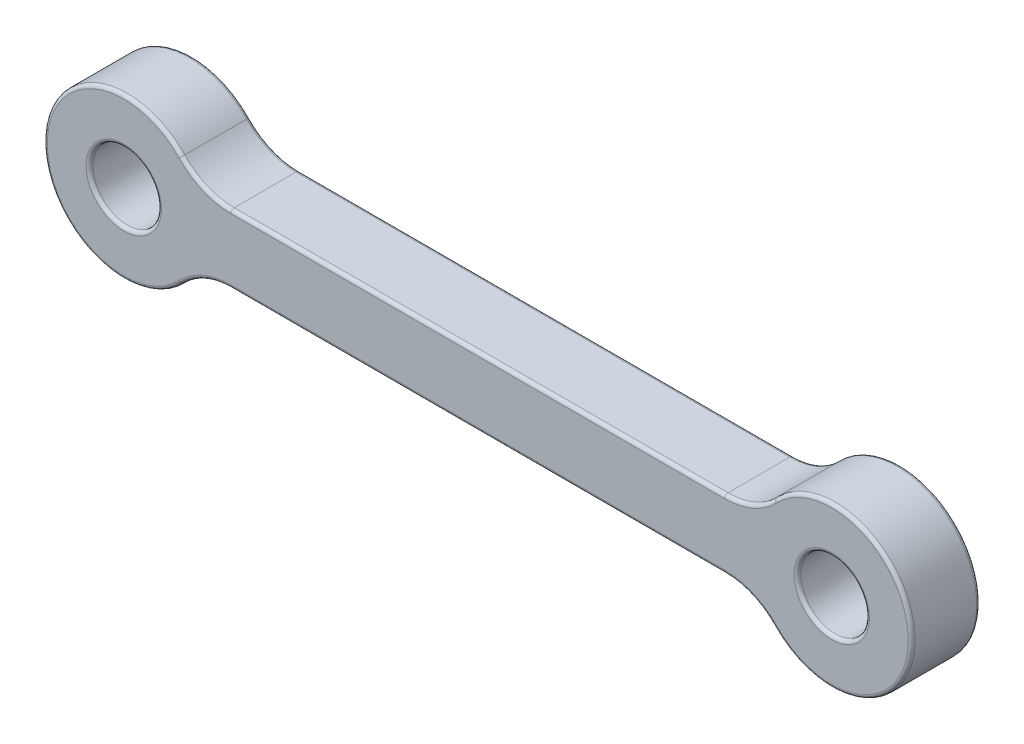
ISO-10303-21;
HEADER;
FILE_DESCRIPTION(('STEP AP214'),'2;1');
FILE_NAME('part.step','',(''),(''),'','','');
FILE_SCHEMA(('AUTOMOTIVE_DESIGN { 1 0 10303 214 1 1 1 1 }'));
ENDSEC;
DATA;
#1=APPLICATION_CONTEXT('core data for automotive mechanical design processes');
#2=APPLICATION_PROTOCOL_DEFINITION('international standard','automotive_design',2000,#1);
#3=PRODUCT_CONTEXT('',#1,'mechanical');
#4=PRODUCT('Part','Part','',(#3));
#5=PRODUCT_RELATED_PRODUCT_CATEGORY('part','',(#4));
#6=PRODUCT_DEFINITION_FORMATION('','',#4);
#7=PRODUCT_DEFINITION_CONTEXT('part definition',#1,'design');
#8=PRODUCT_DEFINITION('design','',#6,#7);
#9=PRODUCT_DEFINITION_SHAPE('','',#8);
#10=(LENGTH_UNIT() NAMED_UNIT(*) SI_UNIT(.MILLI.,.METRE.));
#11=(NAMED_UNIT(*) PLANE_ANGLE_UNIT() SI_UNIT($,.RADIAN.));
#12=(NAMED_UNIT(*) SI_UNIT($,.STERADIAN.) SOLID_ANGLE_UNIT());
#13=UNCERTAINTY_MEASURE_WITH_UNIT(LENGTH_MEASURE(1.E-05),#10,'distance_accuracy_value','');
#14=(GEOMETRIC_REPRESENTATION_CONTEXT(3) GLOBAL_UNCERTAINTY_ASSIGNED_CONTEXT((#13)) GLOBAL_UNIT_ASSIGNED_CONTEXT((#10,
#11,#12)) REPRESENTATION_CONTEXT('',''));
#15=CARTESIAN_POINT('',(0.,0.,0.));
#16=DIRECTION('',(0.,0.,1.));
#17=DIRECTION('',(1.,0.,0.));
#18=AXIS2_PLACEMENT_3D('',#15,#16,#17);
#19=CARTESIAN_POINT('',(0.,0.,1.5));
#20=DIRECTION('',(0.,0.,-1.));
#21=DIRECTION('',(-1.,0.,0.));
#22=AXIS2_PLACEMENT_3D('',#19,#20,#21);
#23=CYLINDRICAL_SURFACE('',#22,3.5);
#24=DIRECTION('',(0.,0.,-1.));
#25=VECTOR('',#24,1.);
#26=CARTESIAN_POINT('',(2.52560848605877,-2.42307692307692,1.5));
#27=LINE('',#26,#25);
#28=CARTESIAN_POINT('',(2.52560848605877,-2.42307692307692,-1.35));
#29=VERTEX_POINT('',#28);
#30=CARTESIAN_POINT('',(2.52560848605877,-2.42307692307692,1.35));
#31=VERTEX_POINT('',#30);
#32=EDGE_CURVE('E310',#29,#31,#27,.F.);
#33=ORIENTED_EDGE('',*,*,#32,.T.);
#34=CARTESIAN_POINT('',(0.,0.,1.35));
#35=DIRECTION('',(0.,0.,1.));
#36=DIRECTION('',(1.,0.,0.));
#37=AXIS2_PLACEMENT_3D('',#34,#35,#36);
#38=CIRCLE('',#37,3.5);
#39=CARTESIAN_POINT('',(2.52560848605877,2.42307692307692,1.35));
#40=VERTEX_POINT('',#39);
#41=EDGE_CURVE('E238',#31,#40,#38,.F.);
#42=ORIENTED_EDGE('',*,*,#41,.T.);
#43=DIRECTION('',(0.,0.,-1.));
#44=VECTOR('',#43,1.);
#45=CARTESIAN_POINT('',(2.52560848605877,2.42307692307692,1.5));
#46=LINE('',#45,#44);
#47=CARTESIAN_POINT('',(2.52560848605877,2.42307692307692,-1.35));
#48=VERTEX_POINT('',#47);
#49=EDGE_CURVE('E365',#40,#48,#46,.T.);
#50=ORIENTED_EDGE('',*,*,#49,.T.);
#51=CARTESIAN_POINT('',(0.,0.,-1.35));
#52=DIRECTION('',(0.,0.,1.));
#53=DIRECTION('',(1.,0.,0.));
#54=AXIS2_PLACEMENT_3D('',#51,#52,#53);
#55=CIRCLE('',#54,3.5);
#56=EDGE_CURVE('E235',#48,#29,#55,.T.);
#57=ORIENTED_EDGE('',*,*,#56,.T.);
#58=EDGE_LOOP('',(#33,#42,#50,#57));
#59=FACE_BOUND('',#58,.T.);
#60=ADVANCED_FACE('F41',(#59),#23,.T.);
#61=CARTESIAN_POINT('',(0.,-1.5,1.5));
#62=DIRECTION('',(0.,-1.,0.));
#63=DIRECTION('',(0.,0.,-1.));
#64=AXIS2_PLACEMENT_3D('',#61,#62,#63);
#65=PLANE('',#64);
#66=DIRECTION('',(0.,0.,1.));
#67=VECTOR('',#66,1.);
#68=CARTESIAN_POINT('',(26.3095842401766,-1.5,1.5));
#69=LINE('',#68,#67);
#70=CARTESIAN_POINT('',(26.3095842401766,-1.5,-1.35));
#71=VERTEX_POINT('',#70);
#72=CARTESIAN_POINT('',(26.3095842401766,-1.5,1.35));
#73=VERTEX_POINT('',#72);
#74=EDGE_CURVE('E380',#71,#73,#69,.T.);
#75=ORIENTED_EDGE('',*,*,#74,.T.);
#76=DIRECTION('',(-1.,0.,0.));
#77=VECTOR('',#76,1.);
#78=CARTESIAN_POINT('',(0.,-1.5,1.35));
#79=LINE('',#78,#77);
#80=CARTESIAN_POINT('',(4.69041575982343,-1.5,1.35));
#81=VERTEX_POINT('',#80);
#82=EDGE_CURVE('E225',#73,#81,#79,.T.);
#83=ORIENTED_EDGE('',*,*,#82,.T.);
#84=DIRECTION('',(0.,0.,-1.));
#85=VECTOR('',#84,1.);
#86=CARTESIAN_POINT('',(4.69041575982343,-1.5,1.5));
#87=LINE('',#86,#85);
#88=CARTESIAN_POINT('',(4.69041575982343,-1.5,-1.35));
#89=VERTEX_POINT('',#88);
#90=EDGE_CURVE('E384',#81,#89,#87,.T.);
#91=ORIENTED_EDGE('',*,*,#90,.T.);
#92=DIRECTION('',(-1.,0.,0.));
#93=VECTOR('',#92,1.);
#94=CARTESIAN_POINT('',(26.3095842401766,-1.5,-1.35));
#95=LINE('',#94,#93);
#96=EDGE_CURVE('E222',#89,#71,#95,.F.);
#97=ORIENTED_EDGE('',*,*,#96,.T.);
#98=EDGE_LOOP('',(#75,#83,#91,#97));
#99=FACE_BOUND('',#98,.T.);
#100=ADVANCED_FACE('F460',(#99),#65,.T.);
#101=CARTESIAN_POINT('',(31.,0.,1.5));
#102=DIRECTION('',(0.,0.,-1.));
#103=DIRECTION('',(-1.,0.,0.));
#104=AXIS2_PLACEMENT_3D('',#101,#102,#103);
#105=CYLINDRICAL_SURFACE('',#104,3.5);
#106=DIRECTION('',(0.,0.,-1.));
#107=VECTOR('',#106,1.);
#108=CARTESIAN_POINT('',(28.4743915139412,2.42307692307692,1.5));
#109=LINE('',#108,#107);
#110=CARTESIAN_POINT('',(28.4743915139412,2.42307692307692,-1.35));
#111=VERTEX_POINT('',#110);
#112=CARTESIAN_POINT('',(28.4743915139412,2.42307692307692,1.35));
#113=VERTEX_POINT('',#112);
#114=EDGE_CURVE('E358',#111,#113,#109,.F.);
#115=ORIENTED_EDGE('',*,*,#114,.T.);
#116=CARTESIAN_POINT('',(31.,0.,1.35));
#117=DIRECTION('',(0.,0.,1.));
#118=DIRECTION('',(1.,0.,0.));
#119=AXIS2_PLACEMENT_3D('',#116,#117,#118);
#120=CIRCLE('',#119,3.5);
#121=CARTESIAN_POINT('',(28.4743915139412,-2.42307692307692,1.35));
#122=VERTEX_POINT('',#121);
#123=EDGE_CURVE('E213',#113,#122,#120,.F.);
#124=ORIENTED_EDGE('',*,*,#123,.T.);
#125=DIRECTION('',(0.,0.,-1.));
#126=VECTOR('',#125,1.);
#127=CARTESIAN_POINT('',(28.4743915139412,-2.42307692307692,1.5));
#128=LINE('',#127,#126);
#129=CARTESIAN_POINT('',(28.4743915139412,-2.42307692307692,-1.35));
#130=VERTEX_POINT('',#129);
#131=EDGE_CURVE('E369',#122,#130,#128,.T.);
#132=ORIENTED_EDGE('',*,*,#131,.T.);
#133=CARTESIAN_POINT('',(31.,0.,-1.35));
#134=DIRECTION('',(0.,0.,1.));
#135=DIRECTION('',(1.,0.,0.));
#136=AXIS2_PLACEMENT_3D('',#133,#134,#135);
#137=CIRCLE('',#136,3.5);
#138=EDGE_CURVE('E210',#130,#111,#137,.T.);
#139=ORIENTED_EDGE('',*,*,#138,.T.);
#140=EDGE_LOOP('',(#115,#124,#132,#139));
#141=FACE_BOUND('',#140,.T.);
#142=ADVANCED_FACE('F414',(#141),#105,.T.);
#143=CARTESIAN_POINT('',(0.,1.5,1.5));
#144=DIRECTION('',(0.,-1.,0.));
#145=DIRECTION('',(0.,0.,-1.));
#146=AXIS2_PLACEMENT_3D('',#143,#144,#145);
#147=PLANE('',#146);
#148=DIRECTION('',(0.,0.,1.));
#149=VECTOR('',#148,1.);
#150=CARTESIAN_POINT('',(4.69041575982343,1.5,1.5));
#151=LINE('',#150,#149);
#152=CARTESIAN_POINT('',(4.69041575982343,1.5,-1.35));
#153=VERTEX_POINT('',#152);
#154=CARTESIAN_POINT('',(4.69041575982343,1.5,1.35));
#155=VERTEX_POINT('',#154);
#156=EDGE_CURVE('E364',#153,#155,#151,.T.);
#157=ORIENTED_EDGE('',*,*,#156,.T.);
#158=DIRECTION('',(-1.,0.,0.));
#159=VECTOR('',#158,1.);
#160=CARTESIAN_POINT('',(26.3095842401766,1.5,1.35));
#161=LINE('',#160,#159);
#162=CARTESIAN_POINT('',(26.3095842401766,1.5,1.35));
#163=VERTEX_POINT('',#162);
#164=EDGE_CURVE('E250',#155,#163,#161,.F.);
#165=ORIENTED_EDGE('',*,*,#164,.T.);
#166=DIRECTION('',(0.,0.,-1.));
#167=VECTOR('',#166,1.);
#168=CARTESIAN_POINT('',(26.3095842401766,1.5,1.5));
#169=LINE('',#168,#167);
#170=CARTESIAN_POINT('',(26.3095842401766,1.5,-1.35));
#171=VERTEX_POINT('',#170);
#172=EDGE_CURVE('E356',#163,#171,#169,.T.);
#173=ORIENTED_EDGE('',*,*,#172,.T.);
#174=DIRECTION('',(-1.,0.,0.));
#175=VECTOR('',#174,1.);
#176=CARTESIAN_POINT('',(0.,1.5,-1.35));
#177=LINE('',#176,#175);
#178=EDGE_CURVE('E247',#171,#153,#177,.T.);
#179=ORIENTED_EDGE('',*,*,#178,.T.);
#180=EDGE_LOOP('',(#157,#165,#173,#179));
#181=FACE_BOUND('',#180,.T.);
#182=ADVANCED_FACE('F361',(#181),#147,.F.);
#183=CARTESIAN_POINT('',(0.,0.,1.5));
#184=DIRECTION('',(0.,0.,-1.));
#185=DIRECTION('',(-1.,0.,0.));
#186=AXIS2_PLACEMENT_3D('',#183,#184,#185);
#187=CYLINDRICAL_SURFACE('',#186,1.5);
#188=CARTESIAN_POINT('',(0.,0.,1.35));
#189=DIRECTION('',(0.,0.,1.));
#190=DIRECTION('',(1.,0.,0.));
#191=AXIS2_PLACEMENT_3D('',#188,#189,#190);
#192=CIRCLE('',#191,1.5);
#193=CARTESIAN_POINT('',(1.5,0.,1.35));
#194=VERTEX_POINT('',#193);
#195=EDGE_CURVE('E257',#194,#194,#192,.T.);
#196=ORIENTED_EDGE('',*,*,#195,.T.);
#197=EDGE_LOOP('',(#196));
#198=FACE_BOUND('',#197,.T.);
#199=CARTESIAN_POINT('',(0.,0.,-1.35));
#200=DIRECTION('',(0.,0.,1.));
#201=DIRECTION('',(1.,0.,0.));
#202=AXIS2_PLACEMENT_3D('',#199,#200,#201);
#203=CIRCLE('',#202,1.5);
#204=CARTESIAN_POINT('',(1.5,0.,-1.35));
#205=VERTEX_POINT('',#204);
#206=EDGE_CURVE('E253',#205,#205,#203,.F.);
#207=ORIENTED_EDGE('',*,*,#206,.T.);
#208=EDGE_LOOP('',(#207));
#209=FACE_BOUND('',#208,.T.);
#210=ADVANCED_FACE('F471',(#198,#209),#187,.F.);
#211=CARTESIAN_POINT('',(31.,0.,1.5));
#212=DIRECTION('',(0.,0.,-1.));
#213=DIRECTION('',(-1.,0.,0.));
#214=AXIS2_PLACEMENT_3D('',#211,#212,#213);
#215=CYLINDRICAL_SURFACE('',#214,1.5);
#216=CARTESIAN_POINT('',(31.,0.,1.35));
#217=DIRECTION('',(0.,0.,1.));
#218=DIRECTION('',(1.,0.,0.));
#219=AXIS2_PLACEMENT_3D('',#216,#217,#218);
#220=CIRCLE('',#219,1.5);
#221=CARTESIAN_POINT('',(32.5,0.,1.35));
#222=VERTEX_POINT('',#221);
#223=EDGE_CURVE('E201',#222,#222,#220,.T.);
#224=ORIENTED_EDGE('',*,*,#223,.T.);
#225=EDGE_LOOP('',(#224));
#226=FACE_BOUND('',#225,.T.);
#227=CARTESIAN_POINT('',(31.,0.,-1.35));
#228=DIRECTION('',(0.,0.,1.));
#229=DIRECTION('',(1.,0.,0.));
#230=AXIS2_PLACEMENT_3D('',#227,#228,#229);
#231=CIRCLE('',#230,1.5);
#232=CARTESIAN_POINT('',(32.5,0.,-1.35));
#233=VERTEX_POINT('',#232);
#234=EDGE_CURVE('E192',#233,#233,#231,.F.);
#235=ORIENTED_EDGE('',*,*,#234,.T.);
#236=EDGE_LOOP('',(#235));
#237=FACE_BOUND('',#236,.T.);
#238=ADVANCED_FACE('F474',(#226,#237),#215,.F.);
#239=CARTESIAN_POINT('',(0.,0.,1.5));
#240=DIRECTION('',(0.,0.,1.));
#241=DIRECTION('',(1.,0.,0.));
#242=AXIS2_PLACEMENT_3D('',#239,#240,#241);
#243=PLANE('',#242);
#244=CARTESIAN_POINT('',(31.,0.,1.5));
#245=DIRECTION('',(0.,0.,1.));
#246=DIRECTION('',(1.,0.,0.));
#247=AXIS2_PLACEMENT_3D('',#244,#245,#246);
#248=CIRCLE('',#247,1.65);
#249=CARTESIAN_POINT('',(32.65,0.,1.5));
#250=VERTEX_POINT('',#249);
#251=EDGE_CURVE('E187',#250,#250,#248,.F.);
#252=ORIENTED_EDGE('',*,*,#251,.T.);
#253=EDGE_LOOP('',(#252));
#254=FACE_BOUND('',#253,.T.);
#255=CARTESIAN_POINT('',(31.,0.,1.5));
#256=DIRECTION('',(0.,0.,1.));
#257=DIRECTION('',(1.,0.,0.));
#258=AXIS2_PLACEMENT_3D('',#255,#256,#257);
#259=CIRCLE('',#258,3.35);
#260=CARTESIAN_POINT('',(28.5826318776295,-2.31923076923077,1.5));
#261=VERTEX_POINT('',#260);
#262=CARTESIAN_POINT('',(28.5826318776295,2.31923076923077,1.5));
#263=VERTEX_POINT('',#262);
#264=EDGE_CURVE('E184',#261,#263,#259,.T.);
#265=ORIENTED_EDGE('',*,*,#264,.T.);
#266=CARTESIAN_POINT('',(26.3095842401766,4.5,1.5));
#267=DIRECTION('',(0.,0.,1.));
#268=DIRECTION('',(1.,0.,0.));
#269=AXIS2_PLACEMENT_3D('',#266,#267,#268);
#270=CIRCLE('',#269,3.15);
#271=CARTESIAN_POINT('',(26.3095842401766,1.35,1.5));
#272=VERTEX_POINT('',#271);
#273=EDGE_CURVE('E162',#263,#272,#270,.F.);
#274=ORIENTED_EDGE('',*,*,#273,.T.);
#275=DIRECTION('',(-1.,0.,0.));
#276=VECTOR('',#275,1.);
#277=CARTESIAN_POINT('',(4.69041575982343,1.35,1.5));
#278=LINE('',#277,#276);
#279=CARTESIAN_POINT('',(4.69041575982343,1.35,1.5));
#280=VERTEX_POINT('',#279);
#281=EDGE_CURVE('E171',#272,#280,#278,.T.);
#282=ORIENTED_EDGE('',*,*,#281,.T.);
#283=CARTESIAN_POINT('',(4.69041575982343,4.5,1.5));
#284=DIRECTION('',(0.,0.,1.));
#285=DIRECTION('',(1.,0.,0.));
#286=AXIS2_PLACEMENT_3D('',#283,#284,#285);
#287=CIRCLE('',#286,3.15);
#288=CARTESIAN_POINT('',(2.41736812237054,2.31923076923077,1.5));
#289=VERTEX_POINT('',#288);
#290=EDGE_CURVE('E178',#280,#289,#287,.F.);
#291=ORIENTED_EDGE('',*,*,#290,.T.);
#292=CARTESIAN_POINT('',(0.,0.,1.5));
#293=DIRECTION('',(0.,0.,1.));
#294=DIRECTION('',(1.,0.,0.));
#295=AXIS2_PLACEMENT_3D('',#292,#293,#294);
#296=CIRCLE('',#295,3.35);
#297=CARTESIAN_POINT('',(2.41736812237054,-2.31923076923077,1.5));
#298=VERTEX_POINT('',#297);
#299=EDGE_CURVE('E393',#289,#298,#296,.T.);
#300=ORIENTED_EDGE('',*,*,#299,.T.);
#301=CARTESIAN_POINT('',(4.69041575982343,-4.5,1.5));
#302=DIRECTION('',(0.,0.,1.));
#303=DIRECTION('',(1.,0.,0.));
#304=AXIS2_PLACEMENT_3D('',#301,#302,#303);
#305=CIRCLE('',#304,3.15);
#306=CARTESIAN_POINT('',(4.69041575982343,-1.35,1.5));
#307=VERTEX_POINT('',#306);
#308=EDGE_CURVE('E396',#298,#307,#305,.F.);
#309=ORIENTED_EDGE('',*,*,#308,.T.);
#310=DIRECTION('',(-1.,0.,0.));
#311=VECTOR('',#310,1.);
#312=CARTESIAN_POINT('',(0.,-1.35,1.5));
#313=LINE('',#312,#311);
#314=CARTESIAN_POINT('',(26.3095842401766,-1.35,1.5));
#315=VERTEX_POINT('',#314);
#316=EDGE_CURVE('E399',#307,#315,#313,.F.);
#317=ORIENTED_EDGE('',*,*,#316,.T.);
#318=CARTESIAN_POINT('',(26.3095842401766,-4.5,1.5));
#319=DIRECTION('',(0.,0.,1.));
#320=DIRECTION('',(1.,0.,0.));
#321=AXIS2_PLACEMENT_3D('',#318,#319,#320);
#322=CIRCLE('',#321,3.15);
#323=EDGE_CURVE('E194',#315,#261,#322,.F.);
#324=ORIENTED_EDGE('',*,*,#323,.T.);
#325=EDGE_LOOP('',(#265,#274,#282,#291,#300,#309,#317,#324));
#326=FACE_BOUND('',#325,.T.);
#327=CARTESIAN_POINT('',(0.,0.,1.5));
#328=DIRECTION('',(0.,0.,1.));
#329=DIRECTION('',(1.,0.,0.));
#330=AXIS2_PLACEMENT_3D('',#327,#328,#329);
#331=CIRCLE('',#330,1.65);
#332=CARTESIAN_POINT('',(1.65,0.,1.5));
#333=VERTEX_POINT('',#332);
#334=EDGE_CURVE('E179',#333,#333,#331,.F.);
#335=ORIENTED_EDGE('',*,*,#334,.T.);
#336=EDGE_LOOP('',(#335));
#337=FACE_BOUND('',#336,.T.);
#338=ADVANCED_FACE('F181',(#254,#326,#337),#243,.T.);
#339=CARTESIAN_POINT('',(0.,0.,-1.5));
#340=DIRECTION('',(0.,0.,1.));
#341=DIRECTION('',(1.,0.,0.));
#342=AXIS2_PLACEMENT_3D('',#339,#340,#341);
#343=PLANE('',#342);
#344=CARTESIAN_POINT('',(31.,0.,-1.5));
#345=DIRECTION('',(0.,0.,1.));
#346=DIRECTION('',(1.,0.,0.));
#347=AXIS2_PLACEMENT_3D('',#344,#345,#346);
#348=CIRCLE('',#347,1.65);
#349=CARTESIAN_POINT('',(32.65,0.,-1.5));
#350=VERTEX_POINT('',#349);
#351=EDGE_CURVE('E11',#350,#350,#348,.T.);
#352=ORIENTED_EDGE('',*,*,#351,.T.);
#353=EDGE_LOOP('',(#352));
#354=FACE_BOUND('',#353,.T.);
#355=DIRECTION('',(-1.,0.,0.));
#356=VECTOR('',#355,1.);
#357=CARTESIAN_POINT('',(4.69041575982343,-1.35,-1.5));
#358=LINE('',#357,#356);
#359=CARTESIAN_POINT('',(26.3095842401766,-1.35,-1.5));
#360=VERTEX_POINT('',#359);
#361=CARTESIAN_POINT('',(4.69041575982343,-1.35,-1.5));
#362=VERTEX_POINT('',#361);
#363=EDGE_CURVE('E59',#360,#362,#358,.T.);
#364=ORIENTED_EDGE('',*,*,#363,.T.);
#365=CARTESIAN_POINT('',(4.69041575982343,-4.5,-1.5));
#366=DIRECTION('',(0.,0.,1.));
#367=DIRECTION('',(1.,0.,0.));
#368=AXIS2_PLACEMENT_3D('',#365,#366,#367);
#369=CIRCLE('',#368,3.15);
#370=CARTESIAN_POINT('',(2.41736812237054,-2.31923076923077,-1.5));
#371=VERTEX_POINT('',#370);
#372=EDGE_CURVE('E51',#362,#371,#369,.T.);
#373=ORIENTED_EDGE('',*,*,#372,.T.);
#374=CARTESIAN_POINT('',(0.,0.,-1.5));
#375=DIRECTION('',(0.,0.,1.));
#376=DIRECTION('',(1.,0.,0.));
#377=AXIS2_PLACEMENT_3D('',#374,#375,#376);
#378=CIRCLE('',#377,3.35);
#379=CARTESIAN_POINT('',(2.41736812237054,2.31923076923077,-1.5));
#380=VERTEX_POINT('',#379);
#381=EDGE_CURVE('E265',#371,#380,#378,.F.);
#382=ORIENTED_EDGE('',*,*,#381,.T.);
#383=CARTESIAN_POINT('',(4.69041575982343,4.5,-1.5));
#384=DIRECTION('',(0.,0.,1.));
#385=DIRECTION('',(1.,0.,0.));
#386=AXIS2_PLACEMENT_3D('',#383,#384,#385);
#387=CIRCLE('',#386,3.15);
#388=CARTESIAN_POINT('',(4.69041575982343,1.35,-1.5));
#389=VERTEX_POINT('',#388);
#390=EDGE_CURVE('E268',#380,#389,#387,.T.);
#391=ORIENTED_EDGE('',*,*,#390,.T.);
#392=DIRECTION('',(-1.,0.,0.));
#393=VECTOR('',#392,1.);
#394=CARTESIAN_POINT('',(0.,1.35,-1.5));
#395=LINE('',#394,#393);
#396=CARTESIAN_POINT('',(26.3095842401766,1.35,-1.5));
#397=VERTEX_POINT('',#396);
#398=EDGE_CURVE('E271',#389,#397,#395,.F.);
#399=ORIENTED_EDGE('',*,*,#398,.T.);
#400=CARTESIAN_POINT('',(26.3095842401766,4.5,-1.5));
#401=DIRECTION('',(0.,0.,1.));
#402=DIRECTION('',(1.,0.,0.));
#403=AXIS2_PLACEMENT_3D('',#400,#401,#402);
#404=CIRCLE('',#403,3.15);
#405=CARTESIAN_POINT('',(28.5826318776295,2.31923076923077,-1.5));
#406=VERTEX_POINT('',#405);
#407=EDGE_CURVE('E274',#397,#406,#404,.T.);
#408=ORIENTED_EDGE('',*,*,#407,.T.);
#409=CARTESIAN_POINT('',(31.,0.,-1.5));
#410=DIRECTION('',(0.,0.,1.));
#411=DIRECTION('',(1.,0.,0.));
#412=AXIS2_PLACEMENT_3D('',#409,#410,#411);
#413=CIRCLE('',#412,3.35);
#414=CARTESIAN_POINT('',(28.5826318776295,-2.31923076923077,-1.5));
#415=VERTEX_POINT('',#414);
#416=EDGE_CURVE('E277',#406,#415,#413,.F.);
#417=ORIENTED_EDGE('',*,*,#416,.T.);
#418=CARTESIAN_POINT('',(26.3095842401766,-4.5,-1.5));
#419=DIRECTION('',(0.,0.,1.));
#420=DIRECTION('',(1.,0.,0.));
#421=AXIS2_PLACEMENT_3D('',#418,#419,#420);
#422=CIRCLE('',#421,3.15);
#423=EDGE_CURVE('E64',#415,#360,#422,.T.);
#424=ORIENTED_EDGE('',*,*,#423,.T.);
#425=EDGE_LOOP('',(#364,#373,#382,#391,#399,#408,#417,#424));
#426=FACE_BOUND('',#425,.T.);
#427=CARTESIAN_POINT('',(0.,0.,-1.5));
#428=DIRECTION('',(0.,0.,1.));
#429=DIRECTION('',(1.,0.,0.));
#430=AXIS2_PLACEMENT_3D('',#427,#428,#429);
#431=CIRCLE('',#430,1.65);
#432=CARTESIAN_POINT('',(1.65,0.,-1.5));
#433=VERTEX_POINT('',#432);
#434=EDGE_CURVE('E261',#433,#433,#431,.T.);
#435=ORIENTED_EDGE('',*,*,#434,.T.);
#436=EDGE_LOOP('',(#435));
#437=FACE_BOUND('',#436,.T.);
#438=ADVANCED_FACE('F430',(#354,#426,#437),#343,.F.);
#439=CARTESIAN_POINT('',(4.69041575982343,4.5,1.5));
#440=DIRECTION('',(0.,0.,-1.));
#441=DIRECTION('',(-1.,0.,0.));
#442=AXIS2_PLACEMENT_3D('',#439,#440,#441);
#443=CYLINDRICAL_SURFACE('',#442,3.);
#444=ORIENTED_EDGE('',*,*,#49,.F.);
#445=CARTESIAN_POINT('',(4.69041575982343,4.5,1.35));
#446=DIRECTION('',(0.,0.,1.));
#447=DIRECTION('',(1.,0.,0.));
#448=AXIS2_PLACEMENT_3D('',#445,#446,#447);
#449=CIRCLE('',#448,3.);
#450=EDGE_CURVE('E244',#40,#155,#449,.T.);
#451=ORIENTED_EDGE('',*,*,#450,.T.);
#452=ORIENTED_EDGE('',*,*,#156,.F.);
#453=CARTESIAN_POINT('',(4.69041575982343,4.5,-1.35));
#454=DIRECTION('',(0.,0.,1.));
#455=DIRECTION('',(1.,0.,0.));
#456=AXIS2_PLACEMENT_3D('',#453,#454,#455);
#457=CIRCLE('',#456,3.);
#458=EDGE_CURVE('E241',#153,#48,#457,.F.);
#459=ORIENTED_EDGE('',*,*,#458,.T.);
#460=EDGE_LOOP('',(#444,#451,#452,#459));
#461=FACE_BOUND('',#460,.T.);
#462=ADVANCED_FACE('F476',(#461),#443,.F.);
#463=CARTESIAN_POINT('',(26.3095842401766,4.5,1.5));
#464=DIRECTION('',(0.,0.,-1.));
#465=DIRECTION('',(-1.,0.,0.));
#466=AXIS2_PLACEMENT_3D('',#463,#464,#465);
#467=CYLINDRICAL_SURFACE('',#466,3.);
#468=ORIENTED_EDGE('',*,*,#172,.F.);
#469=CARTESIAN_POINT('',(26.3095842401766,4.5,1.35));
#470=DIRECTION('',(0.,0.,1.));
#471=DIRECTION('',(1.,0.,0.));
#472=AXIS2_PLACEMENT_3D('',#469,#470,#471);
#473=CIRCLE('',#472,3.);
#474=EDGE_CURVE('E164',#163,#113,#473,.T.);
#475=ORIENTED_EDGE('',*,*,#474,.T.);
#476=ORIENTED_EDGE('',*,*,#114,.F.);
#477=CARTESIAN_POINT('',(26.3095842401766,4.5,-1.35));
#478=DIRECTION('',(0.,0.,1.));
#479=DIRECTION('',(1.,0.,0.));
#480=AXIS2_PLACEMENT_3D('',#477,#478,#479);
#481=CIRCLE('',#480,3.);
#482=EDGE_CURVE('E205',#111,#171,#481,.F.);
#483=ORIENTED_EDGE('',*,*,#482,.T.);
#484=EDGE_LOOP('',(#468,#475,#476,#483));
#485=FACE_BOUND('',#484,.T.);
#486=ADVANCED_FACE('F355',(#485),#467,.F.);
#487=CARTESIAN_POINT('',(4.69041575982343,-4.5,1.5));
#488=DIRECTION('',(0.,0.,-1.));
#489=DIRECTION('',(-1.,0.,0.));
#490=AXIS2_PLACEMENT_3D('',#487,#488,#489);
#491=CYLINDRICAL_SURFACE('',#490,3.);
#492=ORIENTED_EDGE('',*,*,#90,.F.);
#493=CARTESIAN_POINT('',(4.69041575982343,-4.5,1.35));
#494=DIRECTION('',(0.,0.,1.));
#495=DIRECTION('',(1.,0.,0.));
#496=AXIS2_PLACEMENT_3D('',#493,#494,#495);
#497=CIRCLE('',#496,3.);
#498=EDGE_CURVE('E232',#81,#31,#497,.T.);
#499=ORIENTED_EDGE('',*,*,#498,.T.);
#500=ORIENTED_EDGE('',*,*,#32,.F.);
#501=CARTESIAN_POINT('',(4.69041575982343,-4.5,-1.35));
#502=DIRECTION('',(0.,0.,1.));
#503=DIRECTION('',(1.,0.,0.));
#504=AXIS2_PLACEMENT_3D('',#501,#502,#503);
#505=CIRCLE('',#504,3.);
#506=EDGE_CURVE('E228',#29,#89,#505,.F.);
#507=ORIENTED_EDGE('',*,*,#506,.T.);
#508=EDGE_LOOP('',(#492,#499,#500,#507));
#509=FACE_BOUND('',#508,.T.);
#510=ADVANCED_FACE('F448',(#509),#491,.F.);
#511=CARTESIAN_POINT('',(26.3095842401766,-4.5,1.5));
#512=DIRECTION('',(0.,0.,-1.));
#513=DIRECTION('',(-1.,0.,0.));
#514=AXIS2_PLACEMENT_3D('',#511,#512,#513);
#515=CYLINDRICAL_SURFACE('',#514,3.);
#516=ORIENTED_EDGE('',*,*,#131,.F.);
#517=CARTESIAN_POINT('',(26.3095842401766,-4.5,1.35));
#518=DIRECTION('',(0.,0.,1.));
#519=DIRECTION('',(1.,0.,0.));
#520=AXIS2_PLACEMENT_3D('',#517,#518,#519);
#521=CIRCLE('',#520,3.);
#522=EDGE_CURVE('E219',#122,#73,#521,.T.);
#523=ORIENTED_EDGE('',*,*,#522,.T.);
#524=ORIENTED_EDGE('',*,*,#74,.F.);
#525=CARTESIAN_POINT('',(26.3095842401766,-4.5,-1.35));
#526=DIRECTION('',(0.,0.,1.));
#527=DIRECTION('',(1.,0.,0.));
#528=AXIS2_PLACEMENT_3D('',#525,#526,#527);
#529=CIRCLE('',#528,3.);
#530=EDGE_CURVE('E216',#71,#130,#529,.F.);
#531=ORIENTED_EDGE('',*,*,#530,.T.);
#532=EDGE_LOOP('',(#516,#523,#524,#531));
#533=FACE_BOUND('',#532,.T.);
#534=ADVANCED_FACE('F416',(#533),#515,.F.);
#535=CARTESIAN_POINT('',(31.,0.,1.35));
#536=DIRECTION('',(0.,0.,1.));
#537=DIRECTION('',(1.,0.,0.));
#538=AXIS2_PLACEMENT_3D('',#535,#536,#537);
#539=TOROIDAL_SURFACE('',#538,1.65,0.15);
#540=ORIENTED_EDGE('',*,*,#223,.F.);
#541=EDGE_LOOP('',(#540));
#542=FACE_BOUND('',#541,.T.);
#543=ORIENTED_EDGE('',*,*,#251,.F.);
#544=EDGE_LOOP('',(#543));
#545=FACE_BOUND('',#544,.T.);
#546=ADVANCED_FACE('F486',(#542,#545),#539,.T.);
#547=CARTESIAN_POINT('',(4.69041575982343,-4.5,1.35));
#548=DIRECTION('',(0.,0.,1.));
#549=DIRECTION('',(1.,0.,0.));
#550=AXIS2_PLACEMENT_3D('',#547,#548,#549);
#551=TOROIDAL_SURFACE('',#550,3.15,0.15);
#552=CARTESIAN_POINT('',(2.41736812237054,-2.31923076923077,1.35));
#553=DIRECTION('',(-0.692307692307693,-0.72160242458822,0.));
#554=DIRECTION('',(0.72160242458822,-0.692307692307693,0.));
#555=AXIS2_PLACEMENT_3D('',#552,#553,#554);
#556=CIRCLE('',#555,0.15);
#557=EDGE_CURVE('E302',#31,#298,#556,.T.);
#558=ORIENTED_EDGE('',*,*,#557,.F.);
#559=ORIENTED_EDGE('',*,*,#498,.F.);
#560=CARTESIAN_POINT('',(4.69041575982343,-1.35,1.35));
#561=DIRECTION('',(1.,0.,0.));
#562=DIRECTION('',(0.,0.,-1.));
#563=AXIS2_PLACEMENT_3D('',#560,#561,#562);
#564=CIRCLE('',#563,0.15);
#565=EDGE_CURVE('E306',#307,#81,#564,.T.);
#566=ORIENTED_EDGE('',*,*,#565,.F.);
#567=ORIENTED_EDGE('',*,*,#308,.F.);
#568=EDGE_LOOP('',(#558,#559,#566,#567));
#569=FACE_BOUND('',#568,.T.);
#570=ADVANCED_FACE('F453',(#569),#551,.T.);
#571=CARTESIAN_POINT('',(0.,-1.35,1.35));
#572=DIRECTION('',(-1.,0.,0.));
#573=DIRECTION('',(0.,0.,1.));
#574=AXIS2_PLACEMENT_3D('',#571,#572,#573);
#575=CYLINDRICAL_SURFACE('',#574,0.15);
#576=ORIENTED_EDGE('',*,*,#565,.T.);
#577=ORIENTED_EDGE('',*,*,#82,.F.);
#578=CARTESIAN_POINT('',(26.3095842401766,-1.35,1.35));
#579=DIRECTION('',(1.,0.,0.));
#580=DIRECTION('',(0.,0.,-1.));
#581=AXIS2_PLACEMENT_3D('',#578,#579,#580);
#582=CIRCLE('',#581,0.15);
#583=EDGE_CURVE('E298',#315,#73,#582,.T.);
#584=ORIENTED_EDGE('',*,*,#583,.F.);
#585=ORIENTED_EDGE('',*,*,#316,.F.);
#586=EDGE_LOOP('',(#576,#577,#584,#585));
#587=FACE_BOUND('',#586,.T.);
#588=ADVANCED_FACE('F458',(#587),#575,.T.);
#589=CARTESIAN_POINT('',(0.,0.,1.35));
#590=DIRECTION('',(0.,0.,1.));
#591=DIRECTION('',(1.,0.,0.));
#592=AXIS2_PLACEMENT_3D('',#589,#590,#591);
#593=TOROIDAL_SURFACE('',#592,3.35,0.15);
#594=ORIENTED_EDGE('',*,*,#557,.T.);
#595=ORIENTED_EDGE('',*,*,#299,.F.);
#596=CARTESIAN_POINT('',(2.41736812237054,2.31923076923077,1.35));
#597=DIRECTION('',(0.692307692307693,-0.72160242458822,0.));
#598=DIRECTION('',(0.72160242458822,0.692307692307693,0.));
#599=AXIS2_PLACEMENT_3D('',#596,#597,#598);
#600=CIRCLE('',#599,0.15);
#601=EDGE_CURVE('E294',#40,#289,#600,.T.);
#602=ORIENTED_EDGE('',*,*,#601,.F.);
#603=ORIENTED_EDGE('',*,*,#41,.F.);
#604=EDGE_LOOP('',(#594,#595,#602,#603));
#605=FACE_BOUND('',#604,.T.);
#606=ADVANCED_FACE('F503',(#605),#593,.T.);
#607=CARTESIAN_POINT('',(26.3095842401766,-4.5,1.35));
#608=DIRECTION('',(0.,0.,1.));
#609=DIRECTION('',(1.,0.,0.));
#610=AXIS2_PLACEMENT_3D('',#607,#608,#609);
#611=TOROIDAL_SURFACE('',#610,3.15,0.15);
#612=ORIENTED_EDGE('',*,*,#583,.T.);
#613=ORIENTED_EDGE('',*,*,#522,.F.);
#614=CARTESIAN_POINT('',(28.5826318776295,-2.31923076923077,1.35));
#615=DIRECTION('',(0.692307692307703,-0.72160242458821,0.));
#616=DIRECTION('',(0.72160242458821,0.692307692307703,0.));
#617=AXIS2_PLACEMENT_3D('',#614,#615,#616);
#618=CIRCLE('',#617,0.15);
#619=EDGE_CURVE('E290',#261,#122,#618,.T.);
#620=ORIENTED_EDGE('',*,*,#619,.F.);
#621=ORIENTED_EDGE('',*,*,#323,.F.);
#622=EDGE_LOOP('',(#612,#613,#620,#621));
#623=FACE_BOUND('',#622,.T.);
#624=ADVANCED_FACE('F408',(#623),#611,.T.);
#625=CARTESIAN_POINT('',(4.69041575982343,4.5,1.35));
#626=DIRECTION('',(0.,0.,1.));
#627=DIRECTION('',(1.,0.,0.));
#628=AXIS2_PLACEMENT_3D('',#625,#626,#627);
#629=TOROIDAL_SURFACE('',#628,3.15,0.15);
#630=ORIENTED_EDGE('',*,*,#601,.T.);
#631=ORIENTED_EDGE('',*,*,#290,.F.);
#632=CARTESIAN_POINT('',(4.69041575982343,1.35,1.35));
#633=DIRECTION('',(1.,0.,0.));
#634=DIRECTION('',(0.,0.,-1.));
#635=AXIS2_PLACEMENT_3D('',#632,#633,#634);
#636=CIRCLE('',#635,0.15);
#637=EDGE_CURVE('E174',#155,#280,#636,.T.);
#638=ORIENTED_EDGE('',*,*,#637,.F.);
#639=ORIENTED_EDGE('',*,*,#450,.F.);
#640=EDGE_LOOP('',(#630,#631,#638,#639));
#641=FACE_BOUND('',#640,.T.);
#642=ADVANCED_FACE('F497',(#641),#629,.T.);
#643=CARTESIAN_POINT('',(31.,0.,1.35));
#644=DIRECTION('',(0.,0.,1.));
#645=DIRECTION('',(1.,0.,0.));
#646=AXIS2_PLACEMENT_3D('',#643,#644,#645);
#647=TOROIDAL_SURFACE('',#646,3.35,0.15);
#648=ORIENTED_EDGE('',*,*,#619,.T.);
#649=ORIENTED_EDGE('',*,*,#123,.F.);
#650=CARTESIAN_POINT('',(28.5826318776295,2.31923076923077,1.35));
#651=DIRECTION('',(-0.692307692307698,-0.721602424588214,0.));
#652=DIRECTION('',(0.721602424588214,-0.692307692307698,0.));
#653=AXIS2_PLACEMENT_3D('',#650,#651,#652);
#654=CIRCLE('',#653,0.15);
#655=EDGE_CURVE('E168',#263,#113,#654,.T.);
#656=ORIENTED_EDGE('',*,*,#655,.F.);
#657=ORIENTED_EDGE('',*,*,#264,.F.);
#658=EDGE_LOOP('',(#648,#649,#656,#657));
#659=FACE_BOUND('',#658,.T.);
#660=ADVANCED_FACE('F411',(#659),#647,.T.);
#661=CARTESIAN_POINT('',(0.,1.35,1.35));
#662=DIRECTION('',(1.,0.,0.));
#663=DIRECTION('',(0.,0.,-1.));
#664=AXIS2_PLACEMENT_3D('',#661,#662,#663);
#665=CYLINDRICAL_SURFACE('',#664,0.15);
#666=ORIENTED_EDGE('',*,*,#637,.T.);
#667=ORIENTED_EDGE('',*,*,#281,.F.);
#668=CARTESIAN_POINT('',(26.3095842401766,1.35,1.35));
#669=DIRECTION('',(1.,0.,0.));
#670=DIRECTION('',(0.,0.,-1.));
#671=AXIS2_PLACEMENT_3D('',#668,#669,#670);
#672=CIRCLE('',#671,0.15);
#673=EDGE_CURVE('E158',#163,#272,#672,.T.);
#674=ORIENTED_EDGE('',*,*,#673,.F.);
#675=ORIENTED_EDGE('',*,*,#164,.F.);
#676=EDGE_LOOP('',(#666,#667,#674,#675));
#677=FACE_BOUND('',#676,.T.);
#678=ADVANCED_FACE('F172',(#677),#665,.T.);
#679=CARTESIAN_POINT('',(26.3095842401766,4.5,1.35));
#680=DIRECTION('',(0.,0.,1.));
#681=DIRECTION('',(1.,0.,0.));
#682=AXIS2_PLACEMENT_3D('',#679,#680,#681);
#683=TOROIDAL_SURFACE('',#682,3.15,0.15);
#684=ORIENTED_EDGE('',*,*,#655,.T.);
#685=ORIENTED_EDGE('',*,*,#474,.F.);
#686=ORIENTED_EDGE('',*,*,#673,.T.);
#687=ORIENTED_EDGE('',*,*,#273,.F.);
#688=EDGE_LOOP('',(#684,#685,#686,#687));
#689=FACE_BOUND('',#688,.T.);
#690=ADVANCED_FACE('F160',(#689),#683,.T.);
#691=CARTESIAN_POINT('',(0.,0.,1.35));
#692=DIRECTION('',(0.,0.,1.));
#693=DIRECTION('',(1.,0.,0.));
#694=AXIS2_PLACEMENT_3D('',#691,#692,#693);
#695=TOROIDAL_SURFACE('',#694,1.65,0.15);
#696=ORIENTED_EDGE('',*,*,#334,.F.);
#697=EDGE_LOOP('',(#696));
#698=FACE_BOUND('',#697,.T.);
#699=ORIENTED_EDGE('',*,*,#195,.F.);
#700=EDGE_LOOP('',(#699));
#701=FACE_BOUND('',#700,.T.);
#702=ADVANCED_FACE('F492',(#698,#701),#695,.T.);
#703=CARTESIAN_POINT('',(31.,0.,-1.35));
#704=DIRECTION('',(0.,0.,1.));
#705=DIRECTION('',(1.,0.,0.));
#706=AXIS2_PLACEMENT_3D('',#703,#704,#705);
#707=TOROIDAL_SURFACE('',#706,1.65,0.15);
#708=ORIENTED_EDGE('',*,*,#351,.F.);
#709=EDGE_LOOP('',(#708));
#710=FACE_BOUND('',#709,.T.);
#711=ORIENTED_EDGE('',*,*,#234,.F.);
#712=EDGE_LOOP('',(#711));
#713=FACE_BOUND('',#712,.T.);
#714=ADVANCED_FACE('F513',(#710,#713),#707,.T.);
#715=CARTESIAN_POINT('',(26.3095842401766,4.5,-1.35));
#716=DIRECTION('',(0.,0.,1.));
#717=DIRECTION('',(1.,0.,0.));
#718=AXIS2_PLACEMENT_3D('',#715,#716,#717);
#719=TOROIDAL_SURFACE('',#718,3.15,0.15);
#720=CARTESIAN_POINT('',(26.3095842401766,1.35,-1.35));
#721=DIRECTION('',(-1.,0.,0.));
#722=DIRECTION('',(0.,0.,1.));
#723=AXIS2_PLACEMENT_3D('',#720,#721,#722);
#724=CIRCLE('',#723,0.15);
#725=EDGE_CURVE('E332',#171,#397,#724,.T.);
#726=ORIENTED_EDGE('',*,*,#725,.F.);
#727=ORIENTED_EDGE('',*,*,#482,.F.);
#728=CARTESIAN_POINT('',(28.5826318776295,2.31923076923077,-1.35));
#729=DIRECTION('',(0.692307692307703,0.72160242458821,0.));
#730=DIRECTION('',(-0.72160242458821,0.692307692307703,0.));
#731=AXIS2_PLACEMENT_3D('',#728,#729,#730);
#732=CIRCLE('',#731,0.15);
#733=EDGE_CURVE('E45',#406,#111,#732,.T.);
#734=ORIENTED_EDGE('',*,*,#733,.F.);
#735=ORIENTED_EDGE('',*,*,#407,.F.);
#736=EDGE_LOOP('',(#726,#727,#734,#735));
#737=FACE_BOUND('',#736,.T.);
#738=ADVANCED_FACE('F350',(#737),#719,.T.);
#739=CARTESIAN_POINT('',(31.,0.,-1.35));
#740=DIRECTION('',(0.,0.,1.));
#741=DIRECTION('',(1.,0.,0.));
#742=AXIS2_PLACEMENT_3D('',#739,#740,#741);
#743=TOROIDAL_SURFACE('',#742,3.35,0.15);
#744=ORIENTED_EDGE('',*,*,#733,.T.);
#745=ORIENTED_EDGE('',*,*,#138,.F.);
#746=CARTESIAN_POINT('',(28.5826318776295,-2.31923076923077,-1.35));
#747=DIRECTION('',(-0.692307692307698,0.721602424588214,0.));
#748=DIRECTION('',(-0.721602424588214,-0.692307692307698,0.));
#749=AXIS2_PLACEMENT_3D('',#746,#747,#748);
#750=CIRCLE('',#749,0.15);
#751=EDGE_CURVE('E329',#415,#130,#750,.T.);
#752=ORIENTED_EDGE('',*,*,#751,.F.);
#753=ORIENTED_EDGE('',*,*,#416,.F.);
#754=EDGE_LOOP('',(#744,#745,#752,#753));
#755=FACE_BOUND('',#754,.T.);
#756=ADVANCED_FACE('F345',(#755),#743,.T.);
#757=CARTESIAN_POINT('',(0.,1.35,-1.35));
#758=DIRECTION('',(-1.,0.,0.));
#759=DIRECTION('',(0.,0.,1.));
#760=AXIS2_PLACEMENT_3D('',#757,#758,#759);
#761=CYLINDRICAL_SURFACE('',#760,0.15);
#762=ORIENTED_EDGE('',*,*,#725,.T.);
#763=ORIENTED_EDGE('',*,*,#398,.F.);
#764=CARTESIAN_POINT('',(4.69041575982343,1.35,-1.35));
#765=DIRECTION('',(-1.,0.,0.));
#766=DIRECTION('',(0.,0.,1.));
#767=AXIS2_PLACEMENT_3D('',#764,#765,#766);
#768=CIRCLE('',#767,0.15);
#769=EDGE_CURVE('E325',#153,#389,#768,.T.);
#770=ORIENTED_EDGE('',*,*,#769,.F.);
#771=ORIENTED_EDGE('',*,*,#178,.F.);
#772=EDGE_LOOP('',(#762,#763,#770,#771));
#773=FACE_BOUND('',#772,.T.);
#774=ADVANCED_FACE('F528',(#773),#761,.T.);
#775=CARTESIAN_POINT('',(26.3095842401766,-4.5,-1.35));
#776=DIRECTION('',(0.,0.,1.));
#777=DIRECTION('',(1.,0.,0.));
#778=AXIS2_PLACEMENT_3D('',#775,#776,#777);
#779=TOROIDAL_SURFACE('',#778,3.15,0.15);
#780=ORIENTED_EDGE('',*,*,#751,.T.);
#781=ORIENTED_EDGE('',*,*,#530,.F.);
#782=CARTESIAN_POINT('',(26.3095842401766,-1.35,-1.35));
#783=DIRECTION('',(-1.,0.,0.));
#784=DIRECTION('',(0.,0.,1.));
#785=AXIS2_PLACEMENT_3D('',#782,#783,#784);
#786=CIRCLE('',#785,0.15);
#787=EDGE_CURVE('E321',#360,#71,#786,.T.);
#788=ORIENTED_EDGE('',*,*,#787,.F.);
#789=ORIENTED_EDGE('',*,*,#423,.F.);
#790=EDGE_LOOP('',(#780,#781,#788,#789));
#791=FACE_BOUND('',#790,.T.);
#792=ADVANCED_FACE('F420',(#791),#779,.T.);
#793=CARTESIAN_POINT('',(4.69041575982343,4.5,-1.35));
#794=DIRECTION('',(0.,0.,1.));
#795=DIRECTION('',(1.,0.,0.));
#796=AXIS2_PLACEMENT_3D('',#793,#794,#795);
#797=TOROIDAL_SURFACE('',#796,3.15,0.15);
#798=ORIENTED_EDGE('',*,*,#769,.T.);
#799=ORIENTED_EDGE('',*,*,#390,.F.);
#800=CARTESIAN_POINT('',(2.41736812237054,2.31923076923077,-1.35));
#801=DIRECTION('',(-0.692307692307693,0.72160242458822,0.));
#802=DIRECTION('',(-0.72160242458822,-0.692307692307693,0.));
#803=AXIS2_PLACEMENT_3D('',#800,#801,#802);
#804=CIRCLE('',#803,0.15);
#805=EDGE_CURVE('E317',#48,#380,#804,.T.);
#806=ORIENTED_EDGE('',*,*,#805,.F.);
#807=ORIENTED_EDGE('',*,*,#458,.F.);
#808=EDGE_LOOP('',(#798,#799,#806,#807));
#809=FACE_BOUND('',#808,.T.);
#810=ADVANCED_FACE('F436',(#809),#797,.T.);
#811=CARTESIAN_POINT('',(0.,-1.35,-1.35));
#812=DIRECTION('',(1.,0.,0.));
#813=DIRECTION('',(0.,0.,-1.));
#814=AXIS2_PLACEMENT_3D('',#811,#812,#813);
#815=CYLINDRICAL_SURFACE('',#814,0.15);
#816=ORIENTED_EDGE('',*,*,#787,.T.);
#817=ORIENTED_EDGE('',*,*,#96,.F.);
#818=CARTESIAN_POINT('',(4.69041575982343,-1.35,-1.35));
#819=DIRECTION('',(-1.,0.,0.));
#820=DIRECTION('',(0.,0.,1.));
#821=AXIS2_PLACEMENT_3D('',#818,#819,#820);
#822=CIRCLE('',#821,0.15);
#823=EDGE_CURVE('E314',#362,#89,#822,.T.);
#824=ORIENTED_EDGE('',*,*,#823,.F.);
#825=ORIENTED_EDGE('',*,*,#363,.F.);
#826=EDGE_LOOP('',(#816,#817,#824,#825));
#827=FACE_BOUND('',#826,.T.);
#828=ADVANCED_FACE('F423',(#827),#815,.T.);
#829=CARTESIAN_POINT('',(0.,0.,-1.35));
#830=DIRECTION('',(0.,0.,1.));
#831=DIRECTION('',(1.,0.,0.));
#832=AXIS2_PLACEMENT_3D('',#829,#830,#831);
#833=TOROIDAL_SURFACE('',#832,3.35,0.15);
#834=ORIENTED_EDGE('',*,*,#805,.T.);
#835=ORIENTED_EDGE('',*,*,#381,.F.);
#836=CARTESIAN_POINT('',(2.41736812237054,-2.31923076923077,-1.35));
#837=DIRECTION('',(0.692307692307693,0.72160242458822,0.));
#838=DIRECTION('',(-0.72160242458822,0.692307692307693,0.));
#839=AXIS2_PLACEMENT_3D('',#836,#837,#838);
#840=CIRCLE('',#839,0.15);
#841=EDGE_CURVE('E311',#29,#371,#840,.T.);
#842=ORIENTED_EDGE('',*,*,#841,.F.);
#843=ORIENTED_EDGE('',*,*,#56,.F.);
#844=EDGE_LOOP('',(#834,#835,#842,#843));
#845=FACE_BOUND('',#844,.T.);
#846=ADVANCED_FACE('F440',(#845),#833,.T.);
#847=CARTESIAN_POINT('',(4.69041575982343,-4.5,-1.35));
#848=DIRECTION('',(0.,0.,1.));
#849=DIRECTION('',(1.,0.,0.));
#850=AXIS2_PLACEMENT_3D('',#847,#848,#849);
#851=TOROIDAL_SURFACE('',#850,3.15,0.15);
#852=ORIENTED_EDGE('',*,*,#823,.T.);
#853=ORIENTED_EDGE('',*,*,#506,.F.);
#854=ORIENTED_EDGE('',*,*,#841,.T.);
#855=ORIENTED_EDGE('',*,*,#372,.F.);
#856=EDGE_LOOP('',(#852,#853,#854,#855));
#857=FACE_BOUND('',#856,.T.);
#858=ADVANCED_FACE('F427',(#857),#851,.T.);
#859=CARTESIAN_POINT('',(0.,0.,-1.35));
#860=DIRECTION('',(0.,0.,1.));
#861=DIRECTION('',(1.,0.,0.));
#862=AXIS2_PLACEMENT_3D('',#859,#860,#861);
#863=TOROIDAL_SURFACE('',#862,1.65,0.15);
#864=ORIENTED_EDGE('',*,*,#206,.F.);
#865=EDGE_LOOP('',(#864));
#866=FACE_BOUND('',#865,.T.);
#867=ORIENTED_EDGE('',*,*,#434,.F.);
#868=EDGE_LOOP('',(#867));
#869=FACE_BOUND('',#868,.T.);
#870=ADVANCED_FACE('F43',(#866,#869),#863,.T.);
#871=CLOSED_SHELL('',(#60,#100,#142,#182,#210,#238,#338,#438,#462,#486,#510,#534,#546,#570,#588,
#606,#624,#642,#660,#678,#690,#702,#714,#738,#756,#774,#792,#810,#828,#846,#858,#870));
#872=MANIFOLD_SOLID_BREP('B2',#871);
#873=ADVANCED_BREP_SHAPE_REPRESENTATION('',(#18,#872),#14);
#874=SHAPE_DEFINITION_REPRESENTATION(#9,#873);
ENDSEC;
END-ISO-10303-21;
